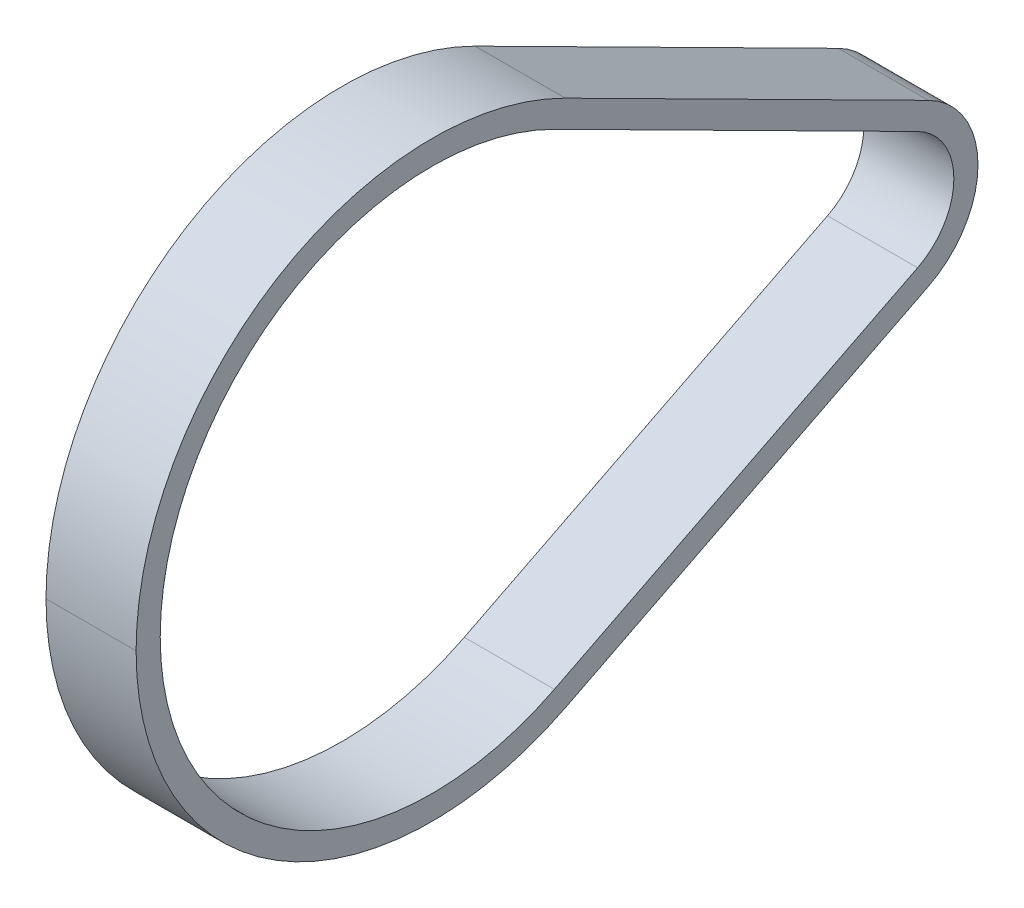
ISO-10303-21;
HEADER;
FILE_DESCRIPTION(('STEP AP214'),'2;1');
FILE_NAME('part.step','',(''),(''),'','','');
FILE_SCHEMA(('AUTOMOTIVE_DESIGN { 1 0 10303 214 1 1 1 1 }'));
ENDSEC;
DATA;
#1=APPLICATION_CONTEXT('core data for automotive mechanical design processes');
#2=APPLICATION_PROTOCOL_DEFINITION('international standard','automotive_design',2000,#1);
#3=PRODUCT_CONTEXT('',#1,'mechanical');
#4=PRODUCT('Part','Part','',(#3));
#5=PRODUCT_RELATED_PRODUCT_CATEGORY('part','',(#4));
#6=PRODUCT_DEFINITION_FORMATION('','',#4);
#7=PRODUCT_DEFINITION_CONTEXT('part definition',#1,'design');
#8=PRODUCT_DEFINITION('design','',#6,#7);
#9=PRODUCT_DEFINITION_SHAPE('','',#8);
#10=(LENGTH_UNIT() NAMED_UNIT(*) SI_UNIT(.MILLI.,.METRE.));
#11=(NAMED_UNIT(*) PLANE_ANGLE_UNIT() SI_UNIT($,.RADIAN.));
#12=(NAMED_UNIT(*) SI_UNIT($,.STERADIAN.) SOLID_ANGLE_UNIT());
#13=UNCERTAINTY_MEASURE_WITH_UNIT(LENGTH_MEASURE(1.E-05),#10,'distance_accuracy_value','');
#14=(GEOMETRIC_REPRESENTATION_CONTEXT(3) GLOBAL_UNCERTAINTY_ASSIGNED_CONTEXT((#13)) GLOBAL_UNIT_ASSIGNED_CONTEXT((#10,
#11,#12)) REPRESENTATION_CONTEXT('',''));
#15=CARTESIAN_POINT('',(0.,0.,0.));
#16=DIRECTION('',(0.,0.,1.));
#17=DIRECTION('',(1.,0.,0.));
#18=AXIS2_PLACEMENT_3D('',#15,#16,#17);
#19=CARTESIAN_POINT('',(4.5,0.,0.));
#20=DIRECTION('',(-1.,0.,0.));
#21=DIRECTION('',(0.,0.,1.));
#22=AXIS2_PLACEMENT_3D('',#19,#20,#21);
#23=CYLINDRICAL_SURFACE('',#22,27.14);
#24=CARTESIAN_POINT('',(4.5,0.,0.));
#25=DIRECTION('',(1.,0.,0.));
#26=DIRECTION('',(0.,0.,-1.));
#27=AXIS2_PLACEMENT_3D('',#24,#25,#26);
#28=CIRCLE('',#27,27.14);
#29=CARTESIAN_POINT('',(4.5,24.2241659155091,-12.2380303030303));
#30=VERTEX_POINT('',#29);
#31=CARTESIAN_POINT('',(4.5,0.,27.14));
#32=VERTEX_POINT('',#31);
#33=EDGE_CURVE('E11',#30,#32,#28,.T.);
#34=ORIENTED_EDGE('',*,*,#33,.T.);
#35=DIRECTION('',(-1.,0.,0.));
#36=VECTOR('',#35,1.);
#37=CARTESIAN_POINT('',(4.5,0.,27.14));
#38=LINE('',#37,#36);
#39=CARTESIAN_POINT('',(-4.5,0.,27.14));
#40=VERTEX_POINT('',#39);
#41=EDGE_CURVE('E25',#32,#40,#38,.T.);
#42=ORIENTED_EDGE('',*,*,#41,.T.);
#43=CARTESIAN_POINT('',(-4.5,0.,0.));
#44=DIRECTION('',(1.,0.,0.));
#45=DIRECTION('',(0.,0.,-1.));
#46=AXIS2_PLACEMENT_3D('',#43,#44,#45);
#47=CIRCLE('',#46,27.14);
#48=CARTESIAN_POINT('',(-4.5,24.2241659155091,-12.2380303030303));
#49=VERTEX_POINT('',#48);
#50=EDGE_CURVE('E131',#49,#40,#47,.T.);
#51=ORIENTED_EDGE('',*,*,#50,.F.);
#52=DIRECTION('',(-1.,0.,0.));
#53=VECTOR('',#52,1.);
#54=CARTESIAN_POINT('',(4.5,24.2241659155091,-12.2380303030303));
#55=LINE('',#54,#53);
#56=EDGE_CURVE('E205',#30,#49,#55,.T.);
#57=ORIENTED_EDGE('',*,*,#56,.F.);
#58=EDGE_LOOP('',(#34,#42,#51,#57));
#59=FACE_BOUND('',#58,.T.);
#60=ADVANCED_FACE('F16',(#59),#23,.F.);
#61=CARTESIAN_POINT('',(4.5,0.,0.));
#62=DIRECTION('',(-1.,0.,0.));
#63=DIRECTION('',(0.,0.,1.));
#64=AXIS2_PLACEMENT_3D('',#61,#62,#63);
#65=CYLINDRICAL_SURFACE('',#64,29.55);
#66=CARTESIAN_POINT('',(4.5,0.,0.));
#67=DIRECTION('',(1.,0.,0.));
#68=DIRECTION('',(0.,0.,-1.));
#69=AXIS2_PLACEMENT_3D('',#66,#67,#68);
#70=CIRCLE('',#69,29.55);
#71=CARTESIAN_POINT('',(4.5,0.,29.55));
#72=VERTEX_POINT('',#71);
#73=CARTESIAN_POINT('',(4.5,-26.3752432867831,-13.3247529644269));
#74=VERTEX_POINT('',#73);
#75=EDGE_CURVE('E143',#72,#74,#70,.T.);
#76=ORIENTED_EDGE('',*,*,#75,.F.);
#77=DIRECTION('',(-1.,0.,0.));
#78=VECTOR('',#77,1.);
#79=CARTESIAN_POINT('',(4.5,0.,29.55));
#80=LINE('',#79,#78);
#81=CARTESIAN_POINT('',(-4.5,0.,29.55));
#82=VERTEX_POINT('',#81);
#83=EDGE_CURVE('E140',#72,#82,#80,.T.);
#84=ORIENTED_EDGE('',*,*,#83,.T.);
#85=CARTESIAN_POINT('',(-4.5,0.,0.));
#86=DIRECTION('',(1.,0.,0.));
#87=DIRECTION('',(0.,0.,-1.));
#88=AXIS2_PLACEMENT_3D('',#85,#86,#87);
#89=CIRCLE('',#88,29.55);
#90=CARTESIAN_POINT('',(-4.5,-26.3752432867831,-13.3247529644269));
#91=VERTEX_POINT('',#90);
#92=EDGE_CURVE('E142',#82,#91,#89,.T.);
#93=ORIENTED_EDGE('',*,*,#92,.T.);
#94=DIRECTION('',(-1.,0.,0.));
#95=VECTOR('',#94,1.);
#96=CARTESIAN_POINT('',(4.5,-26.3752432867831,-13.3247529644269));
#97=LINE('',#96,#95);
#98=EDGE_CURVE('E171',#74,#91,#97,.T.);
#99=ORIENTED_EDGE('',*,*,#98,.F.);
#100=EDGE_LOOP('',(#76,#84,#93,#99));
#101=FACE_BOUND('',#100,.T.);
#102=ADVANCED_FACE('F264',(#101),#65,.T.);
#103=CARTESIAN_POINT('',(4.5,0.,0.));
#104=DIRECTION('',(1.,0.,0.));
#105=DIRECTION('',(0.,1.,0.));
#106=AXIS2_PLACEMENT_3D('',#103,#104,#105);
#107=PLANE('',#106);
#108=CARTESIAN_POINT('',(4.5,0.,0.));
#109=DIRECTION('',(1.,0.,0.));
#110=DIRECTION('',(0.,0.,-1.));
#111=AXIS2_PLACEMENT_3D('',#108,#109,#110);
#112=CIRCLE('',#111,29.55);
#113=CARTESIAN_POINT('',(4.5,26.3752432867831,-13.3247529644269));
#114=VERTEX_POINT('',#113);
#115=EDGE_CURVE('E126',#114,#72,#112,.T.);
#116=ORIENTED_EDGE('',*,*,#115,.T.);
#117=ORIENTED_EDGE('',*,*,#75,.T.);
#118=DIRECTION('',(0.,0.450922266139657,-0.892563224595029));
#119=VECTOR('',#118,1.);
#120=CARTESIAN_POINT('',(4.5,-26.3752432867831,-13.3247529644269));
#121=LINE('',#120,#119);
#122=CARTESIAN_POINT('',(4.5,-8.04645746972419,-49.605064229249));
#123=VERTEX_POINT('',#122);
#124=EDGE_CURVE('E172',#74,#123,#121,.T.);
#125=ORIENTED_EDGE('',*,*,#124,.T.);
#126=CARTESIAN_POINT('',(4.5,0.,-45.54));
#127=DIRECTION('',(1.,0.,0.));
#128=DIRECTION('',(0.,0.,1.));
#129=AXIS2_PLACEMENT_3D('',#126,#127,#128);
#130=CIRCLE('',#129,9.015);
#131=CARTESIAN_POINT('',(4.5,8.04645746972418,-49.605064229249));
#132=VERTEX_POINT('',#131);
#133=EDGE_CURVE('E128',#123,#132,#130,.T.);
#134=ORIENTED_EDGE('',*,*,#133,.T.);
#135=DIRECTION('',(0.,0.450922266139657,0.892563224595029));
#136=VECTOR('',#135,1.);
#137=CARTESIAN_POINT('',(4.5,26.3752432867831,-13.3247529644269));
#138=LINE('',#137,#136);
#139=EDGE_CURVE('E113',#132,#114,#138,.T.);
#140=ORIENTED_EDGE('',*,*,#139,.T.);
#141=EDGE_LOOP('',(#116,#117,#125,#134,#140));
#142=FACE_BOUND('',#141,.T.);
#143=DIRECTION('',(0.,0.450922266139657,-0.892563224595029));
#144=VECTOR('',#143,1.);
#145=CARTESIAN_POINT('',(4.5,-24.2241659155091,-12.2380303030303));
#146=LINE('',#145,#144);
#147=CARTESIAN_POINT('',(4.5,-24.2241659155091,-12.2380303030303));
#148=VERTEX_POINT('',#147);
#149=CARTESIAN_POINT('',(4.5,-5.89538009845016,-48.5183415678524));
#150=VERTEX_POINT('',#149);
#151=EDGE_CURVE('E190',#148,#150,#146,.T.);
#152=ORIENTED_EDGE('',*,*,#151,.F.);
#153=CARTESIAN_POINT('',(4.5,0.,0.));
#154=DIRECTION('',(1.,0.,0.));
#155=DIRECTION('',(0.,0.,-1.));
#156=AXIS2_PLACEMENT_3D('',#153,#154,#155);
#157=CIRCLE('',#156,27.14);
#158=EDGE_CURVE('E198',#32,#148,#157,.T.);
#159=ORIENTED_EDGE('',*,*,#158,.F.);
#160=ORIENTED_EDGE('',*,*,#33,.F.);
#161=DIRECTION('',(0.,0.450922266139657,0.892563224595029));
#162=VECTOR('',#161,1.);
#163=CARTESIAN_POINT('',(4.5,24.2241659155091,-12.2380303030303));
#164=LINE('',#163,#162);
#165=CARTESIAN_POINT('',(4.5,5.89538009845016,-48.5183415678524));
#166=VERTEX_POINT('',#165);
#167=EDGE_CURVE('E200',#166,#30,#164,.T.);
#168=ORIENTED_EDGE('',*,*,#167,.F.);
#169=CARTESIAN_POINT('',(4.5,0.,-45.54));
#170=DIRECTION('',(1.,0.,0.));
#171=DIRECTION('',(0.,0.,1.));
#172=AXIS2_PLACEMENT_3D('',#169,#170,#171);
#173=CIRCLE('',#172,6.605);
#174=EDGE_CURVE('E179',#150,#166,#173,.T.);
#175=ORIENTED_EDGE('',*,*,#174,.F.);
#176=EDGE_LOOP('',(#152,#159,#160,#168,#175));
#177=FACE_BOUND('',#176,.T.);
#178=ADVANCED_FACE('F123',(#142,#177),#107,.T.);
#179=CARTESIAN_POINT('',(-4.5,0.,0.));
#180=DIRECTION('',(1.,0.,0.));
#181=DIRECTION('',(0.,1.,0.));
#182=AXIS2_PLACEMENT_3D('',#179,#180,#181);
#183=PLANE('',#182);
#184=CARTESIAN_POINT('',(-4.5,0.,0.));
#185=DIRECTION('',(1.,0.,0.));
#186=DIRECTION('',(0.,0.,-1.));
#187=AXIS2_PLACEMENT_3D('',#184,#185,#186);
#188=CIRCLE('',#187,29.55);
#189=CARTESIAN_POINT('',(-4.5,26.3752432867831,-13.3247529644269));
#190=VERTEX_POINT('',#189);
#191=EDGE_CURVE('E151',#190,#82,#188,.T.);
#192=ORIENTED_EDGE('',*,*,#191,.F.);
#193=DIRECTION('',(0.,0.450922266139657,0.892563224595029));
#194=VECTOR('',#193,1.);
#195=CARTESIAN_POINT('',(-4.5,26.3752432867831,-13.3247529644269));
#196=LINE('',#195,#194);
#197=CARTESIAN_POINT('',(-4.5,8.04645746972418,-49.605064229249));
#198=VERTEX_POINT('',#197);
#199=EDGE_CURVE('E147',#198,#190,#196,.T.);
#200=ORIENTED_EDGE('',*,*,#199,.F.);
#201=CARTESIAN_POINT('',(-4.5,0.,-45.54));
#202=DIRECTION('',(1.,0.,0.));
#203=DIRECTION('',(0.,0.,1.));
#204=AXIS2_PLACEMENT_3D('',#201,#202,#203);
#205=CIRCLE('',#204,9.015);
#206=CARTESIAN_POINT('',(-4.5,-8.04645746972419,-49.605064229249));
#207=VERTEX_POINT('',#206);
#208=EDGE_CURVE('E167',#207,#198,#205,.T.);
#209=ORIENTED_EDGE('',*,*,#208,.F.);
#210=DIRECTION('',(0.,0.450922266139657,-0.892563224595029));
#211=VECTOR('',#210,1.);
#212=CARTESIAN_POINT('',(-4.5,-26.3752432867831,-13.3247529644269));
#213=LINE('',#212,#211);
#214=EDGE_CURVE('E160',#91,#207,#213,.T.);
#215=ORIENTED_EDGE('',*,*,#214,.F.);
#216=ORIENTED_EDGE('',*,*,#92,.F.);
#217=EDGE_LOOP('',(#192,#200,#209,#215,#216));
#218=FACE_BOUND('',#217,.T.);
#219=ORIENTED_EDGE('',*,*,#50,.T.);
#220=CARTESIAN_POINT('',(-4.5,0.,0.));
#221=DIRECTION('',(1.,0.,0.));
#222=DIRECTION('',(0.,0.,-1.));
#223=AXIS2_PLACEMENT_3D('',#220,#221,#222);
#224=CIRCLE('',#223,27.14);
#225=CARTESIAN_POINT('',(-4.5,-24.2241659155091,-12.2380303030303));
#226=VERTEX_POINT('',#225);
#227=EDGE_CURVE('E208',#40,#226,#224,.T.);
#228=ORIENTED_EDGE('',*,*,#227,.T.);
#229=DIRECTION('',(0.,0.450922266139657,-0.892563224595029));
#230=VECTOR('',#229,1.);
#231=CARTESIAN_POINT('',(-4.5,-24.2241659155091,-12.2380303030303));
#232=LINE('',#231,#230);
#233=CARTESIAN_POINT('',(-4.5,-5.89538009845016,-48.5183415678524));
#234=VERTEX_POINT('',#233);
#235=EDGE_CURVE('E67',#226,#234,#232,.T.);
#236=ORIENTED_EDGE('',*,*,#235,.T.);
#237=CARTESIAN_POINT('',(-4.5,0.,-45.54));
#238=DIRECTION('',(1.,0.,0.));
#239=DIRECTION('',(0.,0.,1.));
#240=AXIS2_PLACEMENT_3D('',#237,#238,#239);
#241=CIRCLE('',#240,6.605);
#242=CARTESIAN_POINT('',(-4.5,5.89538009845015,-48.5183415678524));
#243=VERTEX_POINT('',#242);
#244=EDGE_CURVE('E85',#234,#243,#241,.T.);
#245=ORIENTED_EDGE('',*,*,#244,.T.);
#246=DIRECTION('',(0.,0.450922266139657,0.892563224595029));
#247=VECTOR('',#246,1.);
#248=CARTESIAN_POINT('',(-4.5,24.2241659155091,-12.2380303030303));
#249=LINE('',#248,#247);
#250=EDGE_CURVE('E150',#243,#49,#249,.T.);
#251=ORIENTED_EDGE('',*,*,#250,.T.);
#252=EDGE_LOOP('',(#219,#228,#236,#245,#251));
#253=FACE_BOUND('',#252,.T.);
#254=ADVANCED_FACE('F245',(#218,#253),#183,.F.);
#255=CARTESIAN_POINT('',(4.5,0.,0.));
#256=DIRECTION('',(-1.,0.,0.));
#257=DIRECTION('',(0.,0.,1.));
#258=AXIS2_PLACEMENT_3D('',#255,#256,#257);
#259=CYLINDRICAL_SURFACE('',#258,29.55);
#260=ORIENTED_EDGE('',*,*,#83,.F.);
#261=ORIENTED_EDGE('',*,*,#115,.F.);
#262=DIRECTION('',(-1.,0.,0.));
#263=VECTOR('',#262,1.);
#264=CARTESIAN_POINT('',(4.5,26.3752432867831,-13.3247529644269));
#265=LINE('',#264,#263);
#266=EDGE_CURVE('E138',#114,#190,#265,.T.);
#267=ORIENTED_EDGE('',*,*,#266,.T.);
#268=ORIENTED_EDGE('',*,*,#191,.T.);
#269=EDGE_LOOP('',(#260,#261,#267,#268));
#270=FACE_BOUND('',#269,.T.);
#271=ADVANCED_FACE('F136',(#270),#259,.T.);
#272=CARTESIAN_POINT('',(4.5,-26.3752432867831,-13.3247529644269));
#273=DIRECTION('',(0.,0.892563224595029,0.450922266139657));
#274=DIRECTION('',(1.,0.,0.));
#275=AXIS2_PLACEMENT_3D('',#272,#273,#274);
#276=PLANE('',#275);
#277=ORIENTED_EDGE('',*,*,#214,.T.);
#278=DIRECTION('',(-1.,0.,0.));
#279=VECTOR('',#278,1.);
#280=CARTESIAN_POINT('',(4.5,-8.04645746972419,-49.605064229249));
#281=LINE('',#280,#279);
#282=EDGE_CURVE('E164',#123,#207,#281,.T.);
#283=ORIENTED_EDGE('',*,*,#282,.F.);
#284=ORIENTED_EDGE('',*,*,#124,.F.);
#285=ORIENTED_EDGE('',*,*,#98,.T.);
#286=EDGE_LOOP('',(#277,#283,#284,#285));
#287=FACE_BOUND('',#286,.T.);
#288=ADVANCED_FACE('F244',(#287),#276,.F.);
#289=CARTESIAN_POINT('',(4.5,0.,-45.54));
#290=DIRECTION('',(-1.,0.,0.));
#291=DIRECTION('',(0.,0.,1.));
#292=AXIS2_PLACEMENT_3D('',#289,#290,#291);
#293=CYLINDRICAL_SURFACE('',#292,9.015);
#294=ORIENTED_EDGE('',*,*,#208,.T.);
#295=DIRECTION('',(-1.,0.,0.));
#296=VECTOR('',#295,1.);
#297=CARTESIAN_POINT('',(4.5,8.04645746972418,-49.605064229249));
#298=LINE('',#297,#296);
#299=EDGE_CURVE('E195',#132,#198,#298,.T.);
#300=ORIENTED_EDGE('',*,*,#299,.F.);
#301=ORIENTED_EDGE('',*,*,#133,.F.);
#302=ORIENTED_EDGE('',*,*,#282,.T.);
#303=EDGE_LOOP('',(#294,#300,#301,#302));
#304=FACE_BOUND('',#303,.T.);
#305=ADVANCED_FACE('F304',(#304),#293,.T.);
#306=CARTESIAN_POINT('',(4.5,26.3752432867831,-13.3247529644269));
#307=DIRECTION('',(0.,-0.892563224595029,0.450922266139658));
#308=DIRECTION('',(-1.,0.,0.));
#309=AXIS2_PLACEMENT_3D('',#306,#307,#308);
#310=PLANE('',#309);
#311=ORIENTED_EDGE('',*,*,#199,.T.);
#312=ORIENTED_EDGE('',*,*,#266,.F.);
#313=ORIENTED_EDGE('',*,*,#139,.F.);
#314=ORIENTED_EDGE('',*,*,#299,.T.);
#315=EDGE_LOOP('',(#311,#312,#313,#314));
#316=FACE_BOUND('',#315,.T.);
#317=ADVANCED_FACE('F145',(#316),#310,.F.);
#318=CARTESIAN_POINT('',(4.5,0.,0.));
#319=DIRECTION('',(-1.,0.,0.));
#320=DIRECTION('',(0.,0.,1.));
#321=AXIS2_PLACEMENT_3D('',#318,#319,#320);
#322=CYLINDRICAL_SURFACE('',#321,27.14);
#323=ORIENTED_EDGE('',*,*,#41,.F.);
#324=ORIENTED_EDGE('',*,*,#158,.T.);
#325=DIRECTION('',(-1.,0.,0.));
#326=VECTOR('',#325,1.);
#327=CARTESIAN_POINT('',(4.5,-24.2241659155091,-12.2380303030303));
#328=LINE('',#327,#326);
#329=EDGE_CURVE('E194',#148,#226,#328,.T.);
#330=ORIENTED_EDGE('',*,*,#329,.T.);
#331=ORIENTED_EDGE('',*,*,#227,.F.);
#332=EDGE_LOOP('',(#323,#324,#330,#331));
#333=FACE_BOUND('',#332,.T.);
#334=ADVANCED_FACE('F253',(#333),#322,.F.);
#335=CARTESIAN_POINT('',(4.5,-24.2241659155091,-12.2380303030303));
#336=DIRECTION('',(0.,0.892563224595029,0.450922266139657));
#337=DIRECTION('',(1.,0.,0.));
#338=AXIS2_PLACEMENT_3D('',#335,#336,#337);
#339=PLANE('',#338);
#340=ORIENTED_EDGE('',*,*,#235,.F.);
#341=ORIENTED_EDGE('',*,*,#329,.F.);
#342=ORIENTED_EDGE('',*,*,#151,.T.);
#343=DIRECTION('',(-1.,0.,0.));
#344=VECTOR('',#343,1.);
#345=CARTESIAN_POINT('',(4.5,-5.89538009845016,-48.5183415678524));
#346=LINE('',#345,#344);
#347=EDGE_CURVE('E183',#150,#234,#346,.T.);
#348=ORIENTED_EDGE('',*,*,#347,.T.);
#349=EDGE_LOOP('',(#340,#341,#342,#348));
#350=FACE_BOUND('',#349,.T.);
#351=ADVANCED_FACE('F257',(#350),#339,.T.);
#352=CARTESIAN_POINT('',(4.5,0.,-45.54));
#353=DIRECTION('',(-1.,0.,0.));
#354=DIRECTION('',(0.,0.,1.));
#355=AXIS2_PLACEMENT_3D('',#352,#353,#354);
#356=CYLINDRICAL_SURFACE('',#355,6.605);
#357=ORIENTED_EDGE('',*,*,#244,.F.);
#358=ORIENTED_EDGE('',*,*,#347,.F.);
#359=ORIENTED_EDGE('',*,*,#174,.T.);
#360=DIRECTION('',(-1.,0.,0.));
#361=VECTOR('',#360,1.);
#362=CARTESIAN_POINT('',(4.5,5.89538009845015,-48.5183415678524));
#363=LINE('',#362,#361);
#364=EDGE_CURVE('E184',#166,#243,#363,.T.);
#365=ORIENTED_EDGE('',*,*,#364,.T.);
#366=EDGE_LOOP('',(#357,#358,#359,#365));
#367=FACE_BOUND('',#366,.T.);
#368=ADVANCED_FACE('F287',(#367),#356,.F.);
#369=CARTESIAN_POINT('',(4.5,24.2241659155091,-12.2380303030303));
#370=DIRECTION('',(0.,-0.892563224595029,0.450922266139658));
#371=DIRECTION('',(-1.,0.,0.));
#372=AXIS2_PLACEMENT_3D('',#369,#370,#371);
#373=PLANE('',#372);
#374=ORIENTED_EDGE('',*,*,#250,.F.);
#375=ORIENTED_EDGE('',*,*,#364,.F.);
#376=ORIENTED_EDGE('',*,*,#167,.T.);
#377=ORIENTED_EDGE('',*,*,#56,.T.);
#378=EDGE_LOOP('',(#374,#375,#376,#377));
#379=FACE_BOUND('',#378,.T.);
#380=ADVANCED_FACE('F297',(#379),#373,.T.);
#381=CLOSED_SHELL('',(#60,#102,#178,#254,#271,#288,#305,#317,#334,#351,#368,#380));
#382=MANIFOLD_SOLID_BREP('B1',#381);
#383=ADVANCED_BREP_SHAPE_REPRESENTATION('',(#18,#382),#14);
#384=SHAPE_DEFINITION_REPRESENTATION(#9,#383);
ENDSEC;
END-ISO-10303-21;
